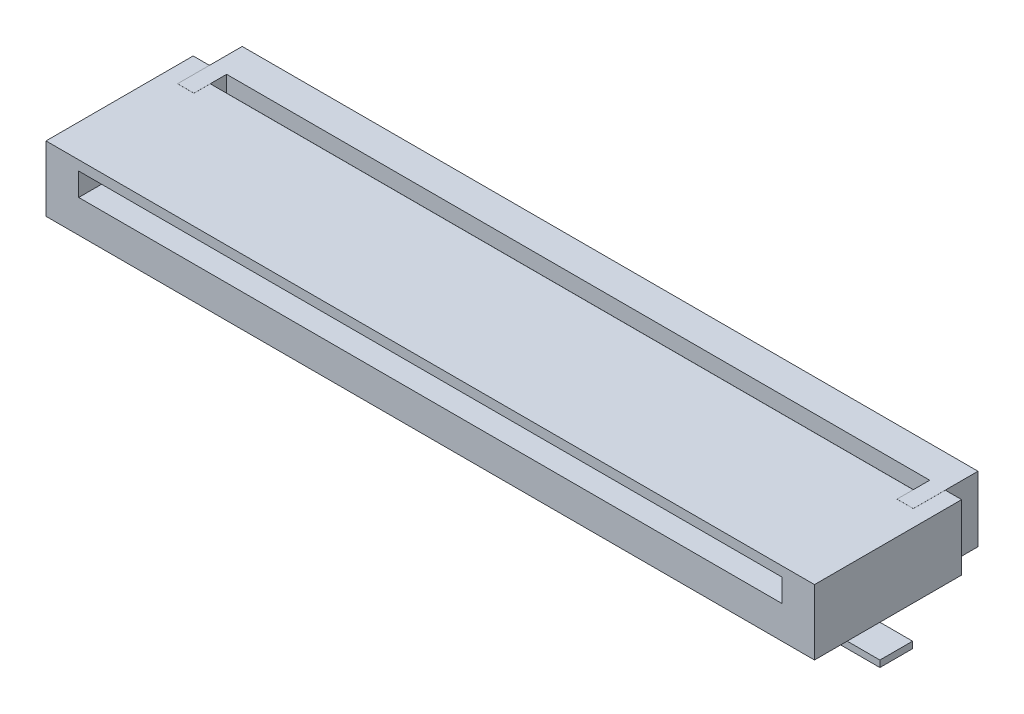
ISO-10303-21;
HEADER;
FILE_DESCRIPTION(('STEP AP214'),'2;1');
FILE_NAME('part.step','',(''),(''),'','','');
FILE_SCHEMA(('AUTOMOTIVE_DESIGN { 1 0 10303 214 1 1 1 1 }'));
ENDSEC;
DATA;
#1=APPLICATION_CONTEXT('core data for automotive mechanical design processes');
#2=APPLICATION_PROTOCOL_DEFINITION('international standard','automotive_design',2000,#1);
#3=PRODUCT_CONTEXT('',#1,'mechanical');
#4=PRODUCT('Part','Part','',(#3));
#5=PRODUCT_RELATED_PRODUCT_CATEGORY('part','',(#4));
#6=PRODUCT_DEFINITION_FORMATION('','',#4);
#7=PRODUCT_DEFINITION_CONTEXT('part definition',#1,'design');
#8=PRODUCT_DEFINITION('design','',#6,#7);
#9=PRODUCT_DEFINITION_SHAPE('','',#8);
#10=(LENGTH_UNIT() NAMED_UNIT(*) SI_UNIT(.MILLI.,.METRE.));
#11=(NAMED_UNIT(*) PLANE_ANGLE_UNIT() SI_UNIT($,.RADIAN.));
#12=(NAMED_UNIT(*) SI_UNIT($,.STERADIAN.) SOLID_ANGLE_UNIT());
#13=UNCERTAINTY_MEASURE_WITH_UNIT(LENGTH_MEASURE(1.E-05),#10,'distance_accuracy_value','');
#14=(GEOMETRIC_REPRESENTATION_CONTEXT(3) GLOBAL_UNCERTAINTY_ASSIGNED_CONTEXT((#13)) GLOBAL_UNIT_ASSIGNED_CONTEXT((#10,
#11,#12)) REPRESENTATION_CONTEXT('',''));
#15=CARTESIAN_POINT('',(0.,0.,0.));
#16=DIRECTION('',(0.,0.,1.));
#17=DIRECTION('',(1.,0.,0.));
#18=AXIS2_PLACEMENT_3D('',#15,#16,#17);
#19=CARTESIAN_POINT('',(11.75,2.,2.75));
#20=DIRECTION('',(-1.,0.,0.));
#21=DIRECTION('',(0.,0.,1.));
#22=AXIS2_PLACEMENT_3D('',#19,#20,#21);
#23=PLANE('',#22);
#24=DIRECTION('',(0.,0.,-1.));
#25=VECTOR('',#24,1.);
#26=CARTESIAN_POINT('',(11.75,1.998,-1.75));
#27=LINE('',#26,#25);
#28=CARTESIAN_POINT('',(11.75,1.998,2.75));
#29=VERTEX_POINT('',#28);
#30=CARTESIAN_POINT('',(11.75,1.998,-1.75));
#31=VERTEX_POINT('',#30);
#32=EDGE_CURVE('E300',#29,#31,#27,.T.);
#33=ORIENTED_EDGE('',*,*,#32,.F.);
#34=DIRECTION('',(0.,-1.,0.));
#35=VECTOR('',#34,1.);
#36=CARTESIAN_POINT('',(11.75,2.,2.75));
#37=LINE('',#36,#35);
#38=CARTESIAN_POINT('',(11.75,0.,2.75));
#39=VERTEX_POINT('',#38);
#40=EDGE_CURVE('E500',#29,#39,#37,.T.);
#41=ORIENTED_EDGE('',*,*,#40,.T.);
#42=DIRECTION('',(0.,0.,-1.));
#43=VECTOR('',#42,1.);
#44=CARTESIAN_POINT('',(11.75,0.,2.75));
#45=LINE('',#44,#43);
#46=CARTESIAN_POINT('',(11.75,0.,1.75));
#47=VERTEX_POINT('',#46);
#48=EDGE_CURVE('E502',#39,#47,#45,.T.);
#49=ORIENTED_EDGE('',*,*,#48,.T.);
#50=CARTESIAN_POINT('',(11.75,0.,0.75));
#51=VERTEX_POINT('',#50);
#52=EDGE_CURVE('E506',#47,#51,#45,.T.);
#53=ORIENTED_EDGE('',*,*,#52,.T.);
#54=CARTESIAN_POINT('',(11.75,0.,-1.75));
#55=VERTEX_POINT('',#54);
#56=EDGE_CURVE('E492',#51,#55,#45,.T.);
#57=ORIENTED_EDGE('',*,*,#56,.T.);
#58=DIRECTION('',(0.,1.,0.));
#59=VECTOR('',#58,1.);
#60=CARTESIAN_POINT('',(11.75,0.,-1.75));
#61=LINE('',#60,#59);
#62=EDGE_CURVE('E472',#55,#31,#61,.T.);
#63=ORIENTED_EDGE('',*,*,#62,.T.);
#64=EDGE_LOOP('',(#33,#41,#49,#53,#57,#63));
#65=FACE_BOUND('',#64,.T.);
#66=ADVANCED_FACE('F37',(#65),#23,.F.);
#67=CARTESIAN_POINT('',(-11.75,2.,2.75));
#68=DIRECTION('',(1.,0.,0.));
#69=DIRECTION('',(0.,0.,-1.));
#70=AXIS2_PLACEMENT_3D('',#67,#68,#69);
#71=PLANE('',#70);
#72=DIRECTION('',(0.,0.,1.));
#73=VECTOR('',#72,1.);
#74=CARTESIAN_POINT('',(-11.75,1.998,-1.75));
#75=LINE('',#74,#73);
#76=CARTESIAN_POINT('',(-11.75,1.998,-1.75));
#77=VERTEX_POINT('',#76);
#78=CARTESIAN_POINT('',(-11.75,1.998,2.75));
#79=VERTEX_POINT('',#78);
#80=EDGE_CURVE('E295',#77,#79,#75,.T.);
#81=ORIENTED_EDGE('',*,*,#80,.F.);
#82=DIRECTION('',(0.,1.,0.));
#83=VECTOR('',#82,1.);
#84=CARTESIAN_POINT('',(-11.75,0.,-1.75));
#85=LINE('',#84,#83);
#86=CARTESIAN_POINT('',(-11.75,0.,-1.75));
#87=VERTEX_POINT('',#86);
#88=EDGE_CURVE('E486',#87,#77,#85,.T.);
#89=ORIENTED_EDGE('',*,*,#88,.F.);
#90=DIRECTION('',(0.,0.,1.));
#91=VECTOR('',#90,1.);
#92=CARTESIAN_POINT('',(-11.75,0.,2.75));
#93=LINE('',#92,#91);
#94=CARTESIAN_POINT('',(-11.75,0.,0.75));
#95=VERTEX_POINT('',#94);
#96=EDGE_CURVE('E509',#87,#95,#93,.T.);
#97=ORIENTED_EDGE('',*,*,#96,.T.);
#98=CARTESIAN_POINT('',(-11.75,0.,1.75));
#99=VERTEX_POINT('',#98);
#100=EDGE_CURVE('E512',#95,#99,#93,.T.);
#101=ORIENTED_EDGE('',*,*,#100,.T.);
#102=CARTESIAN_POINT('',(-11.75,0.,2.75));
#103=VERTEX_POINT('',#102);
#104=EDGE_CURVE('E508',#99,#103,#93,.T.);
#105=ORIENTED_EDGE('',*,*,#104,.T.);
#106=DIRECTION('',(0.,-1.,0.));
#107=VECTOR('',#106,1.);
#108=CARTESIAN_POINT('',(-11.75,2.,2.75));
#109=LINE('',#108,#107);
#110=EDGE_CURVE('E516',#79,#103,#109,.T.);
#111=ORIENTED_EDGE('',*,*,#110,.F.);
#112=EDGE_LOOP('',(#81,#89,#97,#101,#105,#111));
#113=FACE_BOUND('',#112,.T.);
#114=ADVANCED_FACE('F549',(#113),#71,.F.);
#115=CARTESIAN_POINT('',(-11.75,2.,2.75));
#116=DIRECTION('',(0.,0.,-1.));
#117=DIRECTION('',(-1.,0.,0.));
#118=AXIS2_PLACEMENT_3D('',#115,#116,#117);
#119=PLANE('',#118);
#120=DIRECTION('',(1.,0.,0.));
#121=VECTOR('',#120,1.);
#122=CARTESIAN_POINT('',(-10.75,1.,2.75));
#123=LINE('',#122,#121);
#124=CARTESIAN_POINT('',(-10.75,1.,2.75));
#125=VERTEX_POINT('',#124);
#126=CARTESIAN_POINT('',(10.75,1.,2.75));
#127=VERTEX_POINT('',#126);
#128=EDGE_CURVE('E351',#125,#127,#123,.T.);
#129=ORIENTED_EDGE('',*,*,#128,.F.);
#130=DIRECTION('',(0.,-1.,0.));
#131=VECTOR('',#130,1.);
#132=CARTESIAN_POINT('',(-10.75,1.7,2.75));
#133=LINE('',#132,#131);
#134=CARTESIAN_POINT('',(-10.75,1.7,2.75));
#135=VERTEX_POINT('',#134);
#136=EDGE_CURVE('E334',#135,#125,#133,.T.);
#137=ORIENTED_EDGE('',*,*,#136,.F.);
#138=DIRECTION('',(-1.,0.,0.));
#139=VECTOR('',#138,1.);
#140=CARTESIAN_POINT('',(-10.75,1.7,2.75));
#141=LINE('',#140,#139);
#142=CARTESIAN_POINT('',(10.75,1.7,2.75));
#143=VERTEX_POINT('',#142);
#144=EDGE_CURVE('E344',#143,#135,#141,.T.);
#145=ORIENTED_EDGE('',*,*,#144,.F.);
#146=DIRECTION('',(0.,1.,0.));
#147=VECTOR('',#146,1.);
#148=CARTESIAN_POINT('',(10.75,1.7,2.75));
#149=LINE('',#148,#147);
#150=EDGE_CURVE('E354',#127,#143,#149,.T.);
#151=ORIENTED_EDGE('',*,*,#150,.F.);
#152=EDGE_LOOP('',(#129,#137,#145,#151));
#153=FACE_BOUND('',#152,.T.);
#154=DIRECTION('',(1.,0.,0.));
#155=VECTOR('',#154,1.);
#156=CARTESIAN_POINT('',(-11.75,1.998,2.75));
#157=LINE('',#156,#155);
#158=EDGE_CURVE('E298',#79,#29,#157,.T.);
#159=ORIENTED_EDGE('',*,*,#158,.F.);
#160=ORIENTED_EDGE('',*,*,#110,.T.);
#161=DIRECTION('',(1.,0.,0.));
#162=VECTOR('',#161,1.);
#163=CARTESIAN_POINT('',(-11.75,0.,2.75));
#164=LINE('',#163,#162);
#165=EDGE_CURVE('E501',#103,#39,#164,.T.);
#166=ORIENTED_EDGE('',*,*,#165,.T.);
#167=ORIENTED_EDGE('',*,*,#40,.F.);
#168=EDGE_LOOP('',(#159,#160,#166,#167));
#169=FACE_BOUND('',#168,.T.);
#170=ADVANCED_FACE('F555',(#153,#169),#119,.F.);
#171=CARTESIAN_POINT('',(-11.75,0.,-1.75));
#172=DIRECTION('',(0.,0.,1.));
#173=DIRECTION('',(1.,0.,0.));
#174=AXIS2_PLACEMENT_3D('',#171,#172,#173);
#175=PLANE('',#174);
#176=DIRECTION('',(-1.,0.,0.));
#177=VECTOR('',#176,1.);
#178=CARTESIAN_POINT('',(-11.25,1.998,-1.75));
#179=LINE('',#178,#177);
#180=CARTESIAN_POINT('',(-11.25,1.998,-1.75));
#181=VERTEX_POINT('',#180);
#182=EDGE_CURVE('E293',#181,#77,#179,.T.);
#183=ORIENTED_EDGE('',*,*,#182,.F.);
#184=DIRECTION('',(0.,1.,0.));
#185=VECTOR('',#184,1.);
#186=CARTESIAN_POINT('',(-11.25,0.,-1.75));
#187=LINE('',#186,#185);
#188=CARTESIAN_POINT('',(-11.25,0.,-1.75));
#189=VERTEX_POINT('',#188);
#190=EDGE_CURVE('E493',#189,#181,#187,.T.);
#191=ORIENTED_EDGE('',*,*,#190,.F.);
#192=DIRECTION('',(1.,0.,0.));
#193=VECTOR('',#192,1.);
#194=CARTESIAN_POINT('',(-11.75,0.,-1.75));
#195=LINE('',#194,#193);
#196=EDGE_CURVE('E480',#87,#189,#195,.T.);
#197=ORIENTED_EDGE('',*,*,#196,.F.);
#198=ORIENTED_EDGE('',*,*,#88,.T.);
#199=EDGE_LOOP('',(#183,#191,#197,#198));
#200=FACE_BOUND('',#199,.T.);
#201=ADVANCED_FACE('F626',(#200),#175,.F.);
#202=CARTESIAN_POINT('',(11.75,0.,-1.75));
#203=DIRECTION('',(0.,0.,1.));
#204=DIRECTION('',(1.,0.,0.));
#205=AXIS2_PLACEMENT_3D('',#202,#203,#204);
#206=PLANE('',#205);
#207=DIRECTION('',(-1.,0.,0.));
#208=VECTOR('',#207,1.);
#209=CARTESIAN_POINT('',(11.25,1.998,-1.75));
#210=LINE('',#209,#208);
#211=CARTESIAN_POINT('',(11.25,1.998,-1.75));
#212=VERTEX_POINT('',#211);
#213=EDGE_CURVE('E58',#31,#212,#210,.T.);
#214=ORIENTED_EDGE('',*,*,#213,.F.);
#215=ORIENTED_EDGE('',*,*,#62,.F.);
#216=DIRECTION('',(1.,0.,0.));
#217=VECTOR('',#216,1.);
#218=CARTESIAN_POINT('',(11.75,0.,-1.75));
#219=LINE('',#218,#217);
#220=CARTESIAN_POINT('',(11.25,0.,-1.75));
#221=VERTEX_POINT('',#220);
#222=EDGE_CURVE('E467',#221,#55,#219,.T.);
#223=ORIENTED_EDGE('',*,*,#222,.F.);
#224=DIRECTION('',(0.,1.,0.));
#225=VECTOR('',#224,1.);
#226=CARTESIAN_POINT('',(11.25,0.,-1.75));
#227=LINE('',#226,#225);
#228=EDGE_CURVE('E476',#221,#212,#227,.T.);
#229=ORIENTED_EDGE('',*,*,#228,.T.);
#230=EDGE_LOOP('',(#214,#215,#223,#229));
#231=FACE_BOUND('',#230,.T.);
#232=ADVANCED_FACE('F563',(#231),#206,.F.);
#233=CARTESIAN_POINT('',(0.,0.,0.));
#234=DIRECTION('',(0.,-1.,0.));
#235=DIRECTION('',(0.,0.,-1.));
#236=AXIS2_PLACEMENT_3D('',#233,#234,#235);
#237=PLANE('',#236);
#238=DIRECTION('',(0.,0.,-1.));
#239=VECTOR('',#238,1.);
#240=CARTESIAN_POINT('',(10.75,0.,1.75));
#241=LINE('',#240,#239);
#242=CARTESIAN_POINT('',(10.75,0.,1.75));
#243=VERTEX_POINT('',#242);
#244=CARTESIAN_POINT('',(10.75,0.,0.75));
#245=VERTEX_POINT('',#244);
#246=EDGE_CURVE('E410',#243,#245,#241,.T.);
#247=ORIENTED_EDGE('',*,*,#246,.F.);
#248=DIRECTION('',(1.,0.,0.));
#249=VECTOR('',#248,1.);
#250=CARTESIAN_POINT('',(0.,0.,1.75));
#251=LINE('',#250,#249);
#252=EDGE_CURVE('E44',#243,#47,#251,.T.);
#253=ORIENTED_EDGE('',*,*,#252,.T.);
#254=ORIENTED_EDGE('',*,*,#48,.F.);
#255=ORIENTED_EDGE('',*,*,#165,.F.);
#256=ORIENTED_EDGE('',*,*,#104,.F.);
#257=DIRECTION('',(-1.,0.,0.));
#258=VECTOR('',#257,1.);
#259=CARTESIAN_POINT('',(-12.75,0.,1.75));
#260=LINE('',#259,#258);
#261=CARTESIAN_POINT('',(-10.75,0.,1.75));
#262=VERTEX_POINT('',#261);
#263=EDGE_CURVE('E433',#262,#99,#260,.T.);
#264=ORIENTED_EDGE('',*,*,#263,.F.);
#265=DIRECTION('',(0.,0.,1.));
#266=VECTOR('',#265,1.);
#267=CARTESIAN_POINT('',(-10.75,0.,1.75));
#268=LINE('',#267,#266);
#269=CARTESIAN_POINT('',(-10.75,0.,0.75));
#270=VERTEX_POINT('',#269);
#271=EDGE_CURVE('E445',#270,#262,#268,.T.);
#272=ORIENTED_EDGE('',*,*,#271,.F.);
#273=DIRECTION('',(1.,0.,0.));
#274=VECTOR('',#273,1.);
#275=CARTESIAN_POINT('',(-12.75,0.,0.75));
#276=LINE('',#275,#274);
#277=EDGE_CURVE('E446',#95,#270,#276,.T.);
#278=ORIENTED_EDGE('',*,*,#277,.F.);
#279=ORIENTED_EDGE('',*,*,#96,.F.);
#280=ORIENTED_EDGE('',*,*,#196,.T.);
#281=DIRECTION('',(0.,0.,-1.));
#282=VECTOR('',#281,1.);
#283=CARTESIAN_POINT('',(-11.25,0.,-2.75));
#284=LINE('',#283,#282);
#285=CARTESIAN_POINT('',(-11.25,0.,-2.75));
#286=VERTEX_POINT('',#285);
#287=EDGE_CURVE('E483',#189,#286,#284,.T.);
#288=ORIENTED_EDGE('',*,*,#287,.T.);
#289=DIRECTION('',(-1.,0.,0.));
#290=VECTOR('',#289,1.);
#291=CARTESIAN_POINT('',(-11.75,0.,-2.75));
#292=LINE('',#291,#290);
#293=CARTESIAN_POINT('',(11.25,0.,-2.75));
#294=VERTEX_POINT('',#293);
#295=EDGE_CURVE('E505',#294,#286,#292,.T.);
#296=ORIENTED_EDGE('',*,*,#295,.F.);
#297=DIRECTION('',(0.,0.,1.));
#298=VECTOR('',#297,1.);
#299=CARTESIAN_POINT('',(11.25,0.,-2.75));
#300=LINE('',#299,#298);
#301=EDGE_CURVE('E464',#294,#221,#300,.T.);
#302=ORIENTED_EDGE('',*,*,#301,.T.);
#303=ORIENTED_EDGE('',*,*,#222,.T.);
#304=ORIENTED_EDGE('',*,*,#56,.F.);
#305=DIRECTION('',(1.,0.,0.));
#306=VECTOR('',#305,1.);
#307=CARTESIAN_POINT('',(12.75,0.,0.75));
#308=LINE('',#307,#306);
#309=EDGE_CURVE('E414',#245,#51,#308,.T.);
#310=ORIENTED_EDGE('',*,*,#309,.F.);
#311=EDGE_LOOP('',(#247,#253,#254,#255,#256,#264,#272,#278,#279,#280,#288,#296,#302,#303,#304,#310));
#312=FACE_BOUND('',#311,.T.);
#313=DIRECTION('',(-1.,0.,0.));
#314=VECTOR('',#313,1.);
#315=CARTESIAN_POINT('',(10.75,0.,-2.35));
#316=LINE('',#315,#314);
#317=CARTESIAN_POINT('',(10.75,0.,-2.35));
#318=VERTEX_POINT('',#317);
#319=CARTESIAN_POINT('',(-10.75,0.,-2.35));
#320=VERTEX_POINT('',#319);
#321=EDGE_CURVE('E381',#318,#320,#316,.T.);
#322=ORIENTED_EDGE('',*,*,#321,.F.);
#323=DIRECTION('',(0.,0.,1.));
#324=VECTOR('',#323,1.);
#325=CARTESIAN_POINT('',(10.75,0.,-2.55));
#326=LINE('',#325,#324);
#327=CARTESIAN_POINT('',(10.75,0.,-2.55));
#328=VERTEX_POINT('',#327);
#329=EDGE_CURVE('E361',#328,#318,#326,.T.);
#330=ORIENTED_EDGE('',*,*,#329,.F.);
#331=DIRECTION('',(1.,0.,0.));
#332=VECTOR('',#331,1.);
#333=CARTESIAN_POINT('',(10.75,0.,-2.55));
#334=LINE('',#333,#332);
#335=CARTESIAN_POINT('',(-10.75,0.,-2.55));
#336=VERTEX_POINT('',#335);
#337=EDGE_CURVE('E372',#336,#328,#334,.T.);
#338=ORIENTED_EDGE('',*,*,#337,.F.);
#339=DIRECTION('',(0.,0.,-1.));
#340=VECTOR('',#339,1.);
#341=CARTESIAN_POINT('',(-10.75,0.,-2.55));
#342=LINE('',#341,#340);
#343=EDGE_CURVE('E383',#320,#336,#342,.T.);
#344=ORIENTED_EDGE('',*,*,#343,.F.);
#345=EDGE_LOOP('',(#322,#330,#338,#344));
#346=FACE_BOUND('',#345,.T.);
#347=ADVANCED_FACE('F550',(#312,#346),#237,.T.);
#348=CARTESIAN_POINT('',(-11.75,2.,-2.75));
#349=DIRECTION('',(0.,0.,1.));
#350=DIRECTION('',(1.,0.,0.));
#351=AXIS2_PLACEMENT_3D('',#348,#349,#350);
#352=PLANE('',#351);
#353=DIRECTION('',(-1.,0.,0.));
#354=VECTOR('',#353,1.);
#355=CARTESIAN_POINT('',(-11.75,2.,-2.75));
#356=LINE('',#355,#354);
#357=CARTESIAN_POINT('',(11.25,2.,-2.75));
#358=VERTEX_POINT('',#357);
#359=CARTESIAN_POINT('',(-11.25,2.,-2.75));
#360=VERTEX_POINT('',#359);
#361=EDGE_CURVE('E498',#358,#360,#356,.T.);
#362=ORIENTED_EDGE('',*,*,#361,.F.);
#363=DIRECTION('',(0.,1.,0.));
#364=VECTOR('',#363,1.);
#365=CARTESIAN_POINT('',(11.25,0.,-2.75));
#366=LINE('',#365,#364);
#367=EDGE_CURVE('E470',#294,#358,#366,.T.);
#368=ORIENTED_EDGE('',*,*,#367,.F.);
#369=ORIENTED_EDGE('',*,*,#295,.T.);
#370=DIRECTION('',(0.,1.,0.));
#371=VECTOR('',#370,1.);
#372=CARTESIAN_POINT('',(-11.25,0.,-2.75));
#373=LINE('',#372,#371);
#374=EDGE_CURVE('E489',#286,#360,#373,.T.);
#375=ORIENTED_EDGE('',*,*,#374,.T.);
#376=EDGE_LOOP('',(#362,#368,#369,#375));
#377=FACE_BOUND('',#376,.T.);
#378=ADVANCED_FACE('F573',(#377),#352,.F.);
#379=CARTESIAN_POINT('',(0.,2.,0.));
#380=DIRECTION('',(0.,-1.,0.));
#381=DIRECTION('',(0.,0.,-1.));
#382=AXIS2_PLACEMENT_3D('',#379,#380,#381);
#383=PLANE('',#382);
#384=DIRECTION('',(0.,0.,1.));
#385=VECTOR('',#384,1.);
#386=CARTESIAN_POINT('',(-10.75,2.,-0.773341088289437));
#387=LINE('',#386,#385);
#388=CARTESIAN_POINT('',(-10.75,2.,-1.77334108828944));
#389=VERTEX_POINT('',#388);
#390=CARTESIAN_POINT('',(-10.75,2.,-0.773341088289437));
#391=VERTEX_POINT('',#390);
#392=EDGE_CURVE('E326',#389,#391,#387,.T.);
#393=ORIENTED_EDGE('',*,*,#392,.F.);
#394=DIRECTION('',(-1.,0.,0.));
#395=VECTOR('',#394,1.);
#396=CARTESIAN_POINT('',(-10.75,2.,-1.77334108828944));
#397=LINE('',#396,#395);
#398=CARTESIAN_POINT('',(10.75,2.,-1.77334108828944));
#399=VERTEX_POINT('',#398);
#400=EDGE_CURVE('E284',#399,#389,#397,.T.);
#401=ORIENTED_EDGE('',*,*,#400,.F.);
#402=DIRECTION('',(0.,0.,-1.));
#403=VECTOR('',#402,1.);
#404=CARTESIAN_POINT('',(10.75,2.,-0.773341088289437));
#405=LINE('',#404,#403);
#406=CARTESIAN_POINT('',(10.75,2.,-0.773341088289437));
#407=VERTEX_POINT('',#406);
#408=EDGE_CURVE('E270',#407,#399,#405,.T.);
#409=ORIENTED_EDGE('',*,*,#408,.F.);
#410=DIRECTION('',(-1.,0.,0.));
#411=VECTOR('',#410,1.);
#412=CARTESIAN_POINT('',(11.25,2.,-0.773341088289437));
#413=LINE('',#412,#411);
#414=CARTESIAN_POINT('',(11.25,2.,-0.773341088289437));
#415=VERTEX_POINT('',#414);
#416=EDGE_CURVE('E292',#415,#407,#413,.T.);
#417=ORIENTED_EDGE('',*,*,#416,.F.);
#418=DIRECTION('',(0.,0.,1.));
#419=VECTOR('',#418,1.);
#420=CARTESIAN_POINT('',(11.25,2.,-2.75));
#421=LINE('',#420,#419);
#422=EDGE_CURVE('E463',#358,#415,#421,.T.);
#423=ORIENTED_EDGE('',*,*,#422,.F.);
#424=ORIENTED_EDGE('',*,*,#361,.T.);
#425=DIRECTION('',(0.,0.,-1.));
#426=VECTOR('',#425,1.);
#427=CARTESIAN_POINT('',(-11.25,2.,-2.75));
#428=LINE('',#427,#426);
#429=CARTESIAN_POINT('',(-11.25,2.,-0.773341088289437));
#430=VERTEX_POINT('',#429);
#431=EDGE_CURVE('E475',#430,#360,#428,.T.);
#432=ORIENTED_EDGE('',*,*,#431,.F.);
#433=DIRECTION('',(-1.,0.,0.));
#434=VECTOR('',#433,1.);
#435=CARTESIAN_POINT('',(-11.25,2.,-0.773341088289437));
#436=LINE('',#435,#434);
#437=EDGE_CURVE('E296',#391,#430,#436,.T.);
#438=ORIENTED_EDGE('',*,*,#437,.F.);
#439=EDGE_LOOP('',(#393,#401,#409,#417,#423,#424,#432,#438));
#440=FACE_BOUND('',#439,.T.);
#441=ADVANCED_FACE('F576',(#440),#383,.F.);
#442=CARTESIAN_POINT('',(-11.25,0.,-2.75));
#443=DIRECTION('',(1.,0.,0.));
#444=DIRECTION('',(0.,0.,-1.));
#445=AXIS2_PLACEMENT_3D('',#442,#443,#444);
#446=PLANE('',#445);
#447=ORIENTED_EDGE('',*,*,#431,.T.);
#448=ORIENTED_EDGE('',*,*,#374,.F.);
#449=ORIENTED_EDGE('',*,*,#287,.F.);
#450=ORIENTED_EDGE('',*,*,#190,.T.);
#451=DIRECTION('',(0.,0.,-1.));
#452=VECTOR('',#451,1.);
#453=CARTESIAN_POINT('',(-11.25,1.998,-1.75));
#454=LINE('',#453,#452);
#455=CARTESIAN_POINT('',(-11.25,1.998,-0.773341088289437));
#456=VERTEX_POINT('',#455);
#457=EDGE_CURVE('E320',#456,#181,#454,.T.);
#458=ORIENTED_EDGE('',*,*,#457,.F.);
#459=DIRECTION('',(0.,1.,0.));
#460=VECTOR('',#459,1.);
#461=CARTESIAN_POINT('',(-11.25,1.998,-0.773341088289437));
#462=LINE('',#461,#460);
#463=EDGE_CURVE('E331',#456,#430,#462,.T.);
#464=ORIENTED_EDGE('',*,*,#463,.T.);
#465=EDGE_LOOP('',(#447,#448,#449,#450,#458,#464));
#466=FACE_BOUND('',#465,.T.);
#467=ADVANCED_FACE('F580',(#466),#446,.F.);
#468=CARTESIAN_POINT('',(11.25,0.,-2.75));
#469=DIRECTION('',(-1.,0.,0.));
#470=DIRECTION('',(0.,0.,1.));
#471=AXIS2_PLACEMENT_3D('',#468,#469,#470);
#472=PLANE('',#471);
#473=ORIENTED_EDGE('',*,*,#422,.T.);
#474=DIRECTION('',(0.,1.,0.));
#475=VECTOR('',#474,1.);
#476=CARTESIAN_POINT('',(11.25,1.998,-0.773341088289437));
#477=LINE('',#476,#475);
#478=CARTESIAN_POINT('',(11.25,1.998,-0.773341088289437));
#479=VERTEX_POINT('',#478);
#480=EDGE_CURVE('E322',#479,#415,#477,.T.);
#481=ORIENTED_EDGE('',*,*,#480,.F.);
#482=DIRECTION('',(0.,0.,1.));
#483=VECTOR('',#482,1.);
#484=CARTESIAN_POINT('',(11.25,1.998,-1.75));
#485=LINE('',#484,#483);
#486=EDGE_CURVE('E303',#212,#479,#485,.T.);
#487=ORIENTED_EDGE('',*,*,#486,.F.);
#488=ORIENTED_EDGE('',*,*,#228,.F.);
#489=ORIENTED_EDGE('',*,*,#301,.F.);
#490=ORIENTED_EDGE('',*,*,#367,.T.);
#491=EDGE_LOOP('',(#473,#481,#487,#488,#489,#490));
#492=FACE_BOUND('',#491,.T.);
#493=ADVANCED_FACE('F569',(#492),#472,.F.);
#494=CARTESIAN_POINT('',(-12.75,-0.2,1.75));
#495=DIRECTION('',(1.,0.,0.));
#496=DIRECTION('',(0.,0.,-1.));
#497=AXIS2_PLACEMENT_3D('',#494,#495,#496);
#498=PLANE('',#497);
#499=DIRECTION('',(0.,0.,-1.));
#500=VECTOR('',#499,1.);
#501=CARTESIAN_POINT('',(-12.75,0.,1.75));
#502=LINE('',#501,#500);
#503=CARTESIAN_POINT('',(-12.75,0.,1.75));
#504=VERTEX_POINT('',#503);
#505=CARTESIAN_POINT('',(-12.75,0.,0.75));
#506=VERTEX_POINT('',#505);
#507=EDGE_CURVE('E428',#504,#506,#502,.T.);
#508=ORIENTED_EDGE('',*,*,#507,.T.);
#509=DIRECTION('',(0.,1.,0.));
#510=VECTOR('',#509,1.);
#511=CARTESIAN_POINT('',(-12.75,-0.2,0.75));
#512=LINE('',#511,#510);
#513=CARTESIAN_POINT('',(-12.75,-0.2,0.75));
#514=VERTEX_POINT('',#513);
#515=EDGE_CURVE('E460',#514,#506,#512,.T.);
#516=ORIENTED_EDGE('',*,*,#515,.F.);
#517=DIRECTION('',(0.,0.,-1.));
#518=VECTOR('',#517,1.);
#519=CARTESIAN_POINT('',(-12.75,-0.2,1.75));
#520=LINE('',#519,#518);
#521=CARTESIAN_POINT('',(-12.75,-0.2,1.75));
#522=VERTEX_POINT('',#521);
#523=EDGE_CURVE('E429',#522,#514,#520,.T.);
#524=ORIENTED_EDGE('',*,*,#523,.F.);
#525=DIRECTION('',(0.,1.,0.));
#526=VECTOR('',#525,1.);
#527=CARTESIAN_POINT('',(-12.75,-0.2,1.75));
#528=LINE('',#527,#526);
#529=EDGE_CURVE('E439',#522,#504,#528,.T.);
#530=ORIENTED_EDGE('',*,*,#529,.T.);
#531=EDGE_LOOP('',(#508,#516,#524,#530));
#532=FACE_BOUND('',#531,.T.);
#533=ADVANCED_FACE('F538',(#532),#498,.F.);
#534=CARTESIAN_POINT('',(-12.75,-0.2,0.75));
#535=DIRECTION('',(0.,0.,1.));
#536=DIRECTION('',(1.,0.,0.));
#537=AXIS2_PLACEMENT_3D('',#534,#535,#536);
#538=PLANE('',#537);
#539=EDGE_CURVE('E442',#506,#95,#276,.T.);
#540=ORIENTED_EDGE('',*,*,#539,.T.);
#541=ORIENTED_EDGE('',*,*,#277,.T.);
#542=DIRECTION('',(0.,1.,0.));
#543=VECTOR('',#542,1.);
#544=CARTESIAN_POINT('',(-10.75,-0.2,0.75));
#545=LINE('',#544,#543);
#546=CARTESIAN_POINT('',(-10.75,-0.2,0.75));
#547=VERTEX_POINT('',#546);
#548=EDGE_CURVE('E457',#547,#270,#545,.T.);
#549=ORIENTED_EDGE('',*,*,#548,.F.);
#550=DIRECTION('',(1.,0.,0.));
#551=VECTOR('',#550,1.);
#552=CARTESIAN_POINT('',(-12.75,-0.2,0.75));
#553=LINE('',#552,#551);
#554=EDGE_CURVE('E432',#514,#547,#553,.T.);
#555=ORIENTED_EDGE('',*,*,#554,.F.);
#556=ORIENTED_EDGE('',*,*,#515,.T.);
#557=EDGE_LOOP('',(#540,#541,#549,#555,#556));
#558=FACE_BOUND('',#557,.T.);
#559=ADVANCED_FACE('F524',(#558),#538,.F.);
#560=CARTESIAN_POINT('',(-10.75,-0.2,1.75));
#561=DIRECTION('',(-1.,0.,0.));
#562=DIRECTION('',(0.,0.,1.));
#563=AXIS2_PLACEMENT_3D('',#560,#561,#562);
#564=PLANE('',#563);
#565=ORIENTED_EDGE('',*,*,#271,.T.);
#566=DIRECTION('',(0.,1.,0.));
#567=VECTOR('',#566,1.);
#568=CARTESIAN_POINT('',(-10.75,-0.2,1.75));
#569=LINE('',#568,#567);
#570=CARTESIAN_POINT('',(-10.75,-0.2,1.75));
#571=VERTEX_POINT('',#570);
#572=EDGE_CURVE('E454',#571,#262,#569,.T.);
#573=ORIENTED_EDGE('',*,*,#572,.F.);
#574=DIRECTION('',(0.,0.,1.));
#575=VECTOR('',#574,1.);
#576=CARTESIAN_POINT('',(-10.75,-0.2,1.75));
#577=LINE('',#576,#575);
#578=EDGE_CURVE('E435',#547,#571,#577,.T.);
#579=ORIENTED_EDGE('',*,*,#578,.F.);
#580=ORIENTED_EDGE('',*,*,#548,.T.);
#581=EDGE_LOOP('',(#565,#573,#579,#580));
#582=FACE_BOUND('',#581,.T.);
#583=ADVANCED_FACE('F528',(#582),#564,.F.);
#584=CARTESIAN_POINT('',(-12.75,-0.2,1.75));
#585=DIRECTION('',(0.,0.,-1.));
#586=DIRECTION('',(-1.,0.,0.));
#587=AXIS2_PLACEMENT_3D('',#584,#585,#586);
#588=PLANE('',#587);
#589=ORIENTED_EDGE('',*,*,#263,.T.);
#590=EDGE_CURVE('E449',#99,#504,#260,.T.);
#591=ORIENTED_EDGE('',*,*,#590,.T.);
#592=ORIENTED_EDGE('',*,*,#529,.F.);
#593=DIRECTION('',(-1.,0.,0.));
#594=VECTOR('',#593,1.);
#595=CARTESIAN_POINT('',(-12.75,-0.2,1.75));
#596=LINE('',#595,#594);
#597=EDGE_CURVE('E437',#571,#522,#596,.T.);
#598=ORIENTED_EDGE('',*,*,#597,.F.);
#599=ORIENTED_EDGE('',*,*,#572,.T.);
#600=EDGE_LOOP('',(#589,#591,#592,#598,#599));
#601=FACE_BOUND('',#600,.T.);
#602=ADVANCED_FACE('F653',(#601),#588,.F.);
#603=CARTESIAN_POINT('',(0.,-0.2,0.));
#604=DIRECTION('',(0.,-1.,0.));
#605=DIRECTION('',(0.,0.,-1.));
#606=AXIS2_PLACEMENT_3D('',#603,#604,#605);
#607=PLANE('',#606);
#608=ORIENTED_EDGE('',*,*,#523,.T.);
#609=ORIENTED_EDGE('',*,*,#554,.T.);
#610=ORIENTED_EDGE('',*,*,#578,.T.);
#611=ORIENTED_EDGE('',*,*,#597,.T.);
#612=EDGE_LOOP('',(#608,#609,#610,#611));
#613=FACE_BOUND('',#612,.T.);
#614=ADVANCED_FACE('F532',(#613),#607,.T.);
#615=CARTESIAN_POINT('',(0.,0.,0.));
#616=DIRECTION('',(0.,-1.,0.));
#617=DIRECTION('',(0.,0.,-1.));
#618=AXIS2_PLACEMENT_3D('',#615,#616,#617);
#619=PLANE('',#618);
#620=ORIENTED_EDGE('',*,*,#100,.F.);
#621=ORIENTED_EDGE('',*,*,#539,.F.);
#622=ORIENTED_EDGE('',*,*,#507,.F.);
#623=ORIENTED_EDGE('',*,*,#590,.F.);
#624=EDGE_LOOP('',(#620,#621,#622,#623));
#625=FACE_BOUND('',#624,.T.);
#626=ADVANCED_FACE('F542',(#625),#619,.F.);
#627=CARTESIAN_POINT('',(0.,0.,0.));
#628=DIRECTION('',(0.,-1.,0.));
#629=DIRECTION('',(0.,0.,-1.));
#630=AXIS2_PLACEMENT_3D('',#627,#628,#629);
#631=PLANE('',#630);
#632=CARTESIAN_POINT('',(12.75,0.,0.75));
#633=VERTEX_POINT('',#632);
#634=EDGE_CURVE('E413',#51,#633,#308,.T.);
#635=ORIENTED_EDGE('',*,*,#634,.F.);
#636=ORIENTED_EDGE('',*,*,#52,.F.);
#637=DIRECTION('',(-1.,0.,0.));
#638=VECTOR('',#637,1.);
#639=CARTESIAN_POINT('',(12.75,0.,1.75));
#640=LINE('',#639,#638);
#641=CARTESIAN_POINT('',(12.75,0.,1.75));
#642=VERTEX_POINT('',#641);
#643=EDGE_CURVE('E396',#642,#47,#640,.T.);
#644=ORIENTED_EDGE('',*,*,#643,.F.);
#645=DIRECTION('',(0.,0.,1.));
#646=VECTOR('',#645,1.);
#647=CARTESIAN_POINT('',(12.75,0.,1.75));
#648=LINE('',#647,#646);
#649=EDGE_CURVE('E401',#633,#642,#648,.T.);
#650=ORIENTED_EDGE('',*,*,#649,.F.);
#651=EDGE_LOOP('',(#635,#636,#644,#650));
#652=FACE_BOUND('',#651,.T.);
#653=ADVANCED_FACE('F659',(#652),#631,.F.);
#654=CARTESIAN_POINT('',(12.75,-0.2,1.75));
#655=DIRECTION('',(0.,0.,-1.));
#656=DIRECTION('',(-1.,0.,0.));
#657=AXIS2_PLACEMENT_3D('',#654,#655,#656);
#658=PLANE('',#657);
#659=ORIENTED_EDGE('',*,*,#643,.T.);
#660=ORIENTED_EDGE('',*,*,#252,.F.);
#661=DIRECTION('',(0.,1.,0.));
#662=VECTOR('',#661,1.);
#663=CARTESIAN_POINT('',(10.75,-0.2,1.75));
#664=LINE('',#663,#662);
#665=CARTESIAN_POINT('',(10.75,-0.2,1.75));
#666=VERTEX_POINT('',#665);
#667=EDGE_CURVE('E425',#666,#243,#664,.T.);
#668=ORIENTED_EDGE('',*,*,#667,.F.);
#669=DIRECTION('',(-1.,0.,0.));
#670=VECTOR('',#669,1.);
#671=CARTESIAN_POINT('',(12.75,-0.2,1.75));
#672=LINE('',#671,#670);
#673=CARTESIAN_POINT('',(12.75,-0.2,1.75));
#674=VERTEX_POINT('',#673);
#675=EDGE_CURVE('E397',#674,#666,#672,.T.);
#676=ORIENTED_EDGE('',*,*,#675,.F.);
#677=DIRECTION('',(0.,1.,0.));
#678=VECTOR('',#677,1.);
#679=CARTESIAN_POINT('',(12.75,-0.2,1.75));
#680=LINE('',#679,#678);
#681=EDGE_CURVE('E407',#674,#642,#680,.T.);
#682=ORIENTED_EDGE('',*,*,#681,.T.);
#683=EDGE_LOOP('',(#659,#660,#668,#676,#682));
#684=FACE_BOUND('',#683,.T.);
#685=ADVANCED_FACE('F662',(#684),#658,.F.);
#686=CARTESIAN_POINT('',(10.75,-0.2,1.75));
#687=DIRECTION('',(1.,0.,0.));
#688=DIRECTION('',(0.,0.,-1.));
#689=AXIS2_PLACEMENT_3D('',#686,#687,#688);
#690=PLANE('',#689);
#691=ORIENTED_EDGE('',*,*,#246,.T.);
#692=DIRECTION('',(0.,1.,0.));
#693=VECTOR('',#692,1.);
#694=CARTESIAN_POINT('',(10.75,-0.2,0.75));
#695=LINE('',#694,#693);
#696=CARTESIAN_POINT('',(10.75,-0.2,0.75));
#697=VERTEX_POINT('',#696);
#698=EDGE_CURVE('E423',#697,#245,#695,.T.);
#699=ORIENTED_EDGE('',*,*,#698,.F.);
#700=DIRECTION('',(0.,0.,-1.));
#701=VECTOR('',#700,1.);
#702=CARTESIAN_POINT('',(10.75,-0.2,1.75));
#703=LINE('',#702,#701);
#704=EDGE_CURVE('E400',#666,#697,#703,.T.);
#705=ORIENTED_EDGE('',*,*,#704,.F.);
#706=ORIENTED_EDGE('',*,*,#667,.T.);
#707=EDGE_LOOP('',(#691,#699,#705,#706));
#708=FACE_BOUND('',#707,.T.);
#709=ADVANCED_FACE('F665',(#708),#690,.F.);
#710=CARTESIAN_POINT('',(12.75,-0.2,0.75));
#711=DIRECTION('',(0.,0.,1.));
#712=DIRECTION('',(1.,0.,0.));
#713=AXIS2_PLACEMENT_3D('',#710,#711,#712);
#714=PLANE('',#713);
#715=ORIENTED_EDGE('',*,*,#309,.T.);
#716=ORIENTED_EDGE('',*,*,#634,.T.);
#717=DIRECTION('',(0.,1.,0.));
#718=VECTOR('',#717,1.);
#719=CARTESIAN_POINT('',(12.75,-0.2,0.75));
#720=LINE('',#719,#718);
#721=CARTESIAN_POINT('',(12.75,-0.2,0.75));
#722=VERTEX_POINT('',#721);
#723=EDGE_CURVE('E420',#722,#633,#720,.T.);
#724=ORIENTED_EDGE('',*,*,#723,.F.);
#725=DIRECTION('',(1.,0.,0.));
#726=VECTOR('',#725,1.);
#727=CARTESIAN_POINT('',(12.75,-0.2,0.75));
#728=LINE('',#727,#726);
#729=EDGE_CURVE('E403',#697,#722,#728,.T.);
#730=ORIENTED_EDGE('',*,*,#729,.F.);
#731=ORIENTED_EDGE('',*,*,#698,.T.);
#732=EDGE_LOOP('',(#715,#716,#724,#730,#731));
#733=FACE_BOUND('',#732,.T.);
#734=ADVANCED_FACE('F669',(#733),#714,.F.);
#735=CARTESIAN_POINT('',(12.75,-0.2,1.75));
#736=DIRECTION('',(-1.,0.,0.));
#737=DIRECTION('',(0.,0.,1.));
#738=AXIS2_PLACEMENT_3D('',#735,#736,#737);
#739=PLANE('',#738);
#740=ORIENTED_EDGE('',*,*,#649,.T.);
#741=ORIENTED_EDGE('',*,*,#681,.F.);
#742=DIRECTION('',(0.,0.,1.));
#743=VECTOR('',#742,1.);
#744=CARTESIAN_POINT('',(12.75,-0.2,1.75));
#745=LINE('',#744,#743);
#746=EDGE_CURVE('E405',#722,#674,#745,.T.);
#747=ORIENTED_EDGE('',*,*,#746,.F.);
#748=ORIENTED_EDGE('',*,*,#723,.T.);
#749=EDGE_LOOP('',(#740,#741,#747,#748));
#750=FACE_BOUND('',#749,.T.);
#751=ADVANCED_FACE('F673',(#750),#739,.F.);
#752=CARTESIAN_POINT('',(0.,-0.2,0.));
#753=DIRECTION('',(0.,-1.,0.));
#754=DIRECTION('',(0.,0.,-1.));
#755=AXIS2_PLACEMENT_3D('',#752,#753,#754);
#756=PLANE('',#755);
#757=ORIENTED_EDGE('',*,*,#675,.T.);
#758=ORIENTED_EDGE('',*,*,#704,.T.);
#759=ORIENTED_EDGE('',*,*,#729,.T.);
#760=ORIENTED_EDGE('',*,*,#746,.T.);
#761=EDGE_LOOP('',(#757,#758,#759,#760));
#762=FACE_BOUND('',#761,.T.);
#763=ADVANCED_FACE('F677',(#762),#756,.T.);
#764=CARTESIAN_POINT('',(10.75,-0.3,-2.55));
#765=DIRECTION('',(-1.,0.,0.));
#766=DIRECTION('',(0.,0.,1.));
#767=AXIS2_PLACEMENT_3D('',#764,#765,#766);
#768=PLANE('',#767);
#769=ORIENTED_EDGE('',*,*,#329,.T.);
#770=DIRECTION('',(0.,1.,0.));
#771=VECTOR('',#770,1.);
#772=CARTESIAN_POINT('',(10.75,-0.3,-2.35));
#773=LINE('',#772,#771);
#774=CARTESIAN_POINT('',(10.75,-0.3,-2.35));
#775=VERTEX_POINT('',#774);
#776=EDGE_CURVE('E394',#775,#318,#773,.T.);
#777=ORIENTED_EDGE('',*,*,#776,.F.);
#778=DIRECTION('',(0.,0.,1.));
#779=VECTOR('',#778,1.);
#780=CARTESIAN_POINT('',(10.75,-0.3,-2.55));
#781=LINE('',#780,#779);
#782=CARTESIAN_POINT('',(10.75,-0.3,-2.55));
#783=VERTEX_POINT('',#782);
#784=EDGE_CURVE('E368',#783,#775,#781,.T.);
#785=ORIENTED_EDGE('',*,*,#784,.F.);
#786=DIRECTION('',(0.,1.,0.));
#787=VECTOR('',#786,1.);
#788=CARTESIAN_POINT('',(10.75,-0.3,-2.55));
#789=LINE('',#788,#787);
#790=EDGE_CURVE('E378',#783,#328,#789,.T.);
#791=ORIENTED_EDGE('',*,*,#790,.T.);
#792=EDGE_LOOP('',(#769,#777,#785,#791));
#793=FACE_BOUND('',#792,.T.);
#794=ADVANCED_FACE('F684',(#793),#768,.F.);
#795=CARTESIAN_POINT('',(10.75,-0.3,-2.35));
#796=DIRECTION('',(0.,0.,-1.));
#797=DIRECTION('',(-1.,0.,0.));
#798=AXIS2_PLACEMENT_3D('',#795,#796,#797);
#799=PLANE('',#798);
#800=ORIENTED_EDGE('',*,*,#321,.T.);
#801=DIRECTION('',(0.,1.,0.));
#802=VECTOR('',#801,1.);
#803=CARTESIAN_POINT('',(-10.75,-0.3,-2.35));
#804=LINE('',#803,#802);
#805=CARTESIAN_POINT('',(-10.75,-0.3,-2.35));
#806=VERTEX_POINT('',#805);
#807=EDGE_CURVE('E391',#806,#320,#804,.T.);
#808=ORIENTED_EDGE('',*,*,#807,.F.);
#809=DIRECTION('',(-1.,0.,0.));
#810=VECTOR('',#809,1.);
#811=CARTESIAN_POINT('',(10.75,-0.3,-2.35));
#812=LINE('',#811,#810);
#813=EDGE_CURVE('E371',#775,#806,#812,.T.);
#814=ORIENTED_EDGE('',*,*,#813,.F.);
#815=ORIENTED_EDGE('',*,*,#776,.T.);
#816=EDGE_LOOP('',(#800,#808,#814,#815));
#817=FACE_BOUND('',#816,.T.);
#818=ADVANCED_FACE('F688',(#817),#799,.F.);
#819=CARTESIAN_POINT('',(-10.75,-0.3,-2.55));
#820=DIRECTION('',(1.,0.,0.));
#821=DIRECTION('',(0.,0.,-1.));
#822=AXIS2_PLACEMENT_3D('',#819,#820,#821);
#823=PLANE('',#822);
#824=ORIENTED_EDGE('',*,*,#343,.T.);
#825=DIRECTION('',(0.,1.,0.));
#826=VECTOR('',#825,1.);
#827=CARTESIAN_POINT('',(-10.75,-0.3,-2.55));
#828=LINE('',#827,#826);
#829=CARTESIAN_POINT('',(-10.75,-0.3,-2.55));
#830=VERTEX_POINT('',#829);
#831=EDGE_CURVE('E389',#830,#336,#828,.T.);
#832=ORIENTED_EDGE('',*,*,#831,.F.);
#833=DIRECTION('',(0.,0.,-1.));
#834=VECTOR('',#833,1.);
#835=CARTESIAN_POINT('',(-10.75,-0.3,-2.55));
#836=LINE('',#835,#834);
#837=EDGE_CURVE('E374',#806,#830,#836,.T.);
#838=ORIENTED_EDGE('',*,*,#837,.F.);
#839=ORIENTED_EDGE('',*,*,#807,.T.);
#840=EDGE_LOOP('',(#824,#832,#838,#839));
#841=FACE_BOUND('',#840,.T.);
#842=ADVANCED_FACE('F692',(#841),#823,.F.);
#843=CARTESIAN_POINT('',(10.75,-0.3,-2.55));
#844=DIRECTION('',(0.,0.,1.));
#845=DIRECTION('',(1.,0.,0.));
#846=AXIS2_PLACEMENT_3D('',#843,#844,#845);
#847=PLANE('',#846);
#848=ORIENTED_EDGE('',*,*,#337,.T.);
#849=ORIENTED_EDGE('',*,*,#790,.F.);
#850=DIRECTION('',(1.,0.,0.));
#851=VECTOR('',#850,1.);
#852=CARTESIAN_POINT('',(10.75,-0.3,-2.55));
#853=LINE('',#852,#851);
#854=EDGE_CURVE('E376',#830,#783,#853,.T.);
#855=ORIENTED_EDGE('',*,*,#854,.F.);
#856=ORIENTED_EDGE('',*,*,#831,.T.);
#857=EDGE_LOOP('',(#848,#849,#855,#856));
#858=FACE_BOUND('',#857,.T.);
#859=ADVANCED_FACE('F696',(#858),#847,.F.);
#860=CARTESIAN_POINT('',(0.,-0.3,0.));
#861=DIRECTION('',(0.,-1.,0.));
#862=DIRECTION('',(0.,0.,-1.));
#863=AXIS2_PLACEMENT_3D('',#860,#861,#862);
#864=PLANE('',#863);
#865=ORIENTED_EDGE('',*,*,#784,.T.);
#866=ORIENTED_EDGE('',*,*,#813,.T.);
#867=ORIENTED_EDGE('',*,*,#837,.T.);
#868=ORIENTED_EDGE('',*,*,#854,.T.);
#869=EDGE_LOOP('',(#865,#866,#867,#868));
#870=FACE_BOUND('',#869,.T.);
#871=ADVANCED_FACE('F700',(#870),#864,.T.);
#872=CARTESIAN_POINT('',(-10.75,1.7,-1.75));
#873=DIRECTION('',(-1.,0.,0.));
#874=DIRECTION('',(0.,0.,1.));
#875=AXIS2_PLACEMENT_3D('',#872,#873,#874);
#876=PLANE('',#875);
#877=DIRECTION('',(0.,1.,0.));
#878=VECTOR('',#877,1.);
#879=CARTESIAN_POINT('',(-10.75,1.5,-1.27334108828944));
#880=LINE('',#879,#878);
#881=CARTESIAN_POINT('',(-10.75,1.7,-1.27334108828944));
#882=VERTEX_POINT('',#881);
#883=CARTESIAN_POINT('',(-10.75,1.998,-1.27334108828944));
#884=VERTEX_POINT('',#883);
#885=EDGE_CURVE('E279',#882,#884,#880,.T.);
#886=ORIENTED_EDGE('',*,*,#885,.F.);
#887=DIRECTION('',(0.,0.,1.));
#888=VECTOR('',#887,1.);
#889=CARTESIAN_POINT('',(-10.75,1.7,-1.75));
#890=LINE('',#889,#888);
#891=EDGE_CURVE('E359',#882,#135,#890,.T.);
#892=ORIENTED_EDGE('',*,*,#891,.T.);
#893=ORIENTED_EDGE('',*,*,#136,.T.);
#894=DIRECTION('',(0.,0.,1.));
#895=VECTOR('',#894,1.);
#896=CARTESIAN_POINT('',(-10.75,1.,-1.75));
#897=LINE('',#896,#895);
#898=CARTESIAN_POINT('',(-10.75,1.,-1.75));
#899=VERTEX_POINT('',#898);
#900=EDGE_CURVE('E349',#899,#125,#897,.T.);
#901=ORIENTED_EDGE('',*,*,#900,.F.);
#902=DIRECTION('',(0.,-1.,0.));
#903=VECTOR('',#902,1.);
#904=CARTESIAN_POINT('',(-10.75,1.7,-1.75));
#905=LINE('',#904,#903);
#906=CARTESIAN_POINT('',(-10.75,1.5,-1.75));
#907=VERTEX_POINT('',#906);
#908=EDGE_CURVE('E341',#907,#899,#905,.T.);
#909=ORIENTED_EDGE('',*,*,#908,.F.);
#910=DIRECTION('',(0.,0.,1.));
#911=VECTOR('',#910,1.);
#912=CARTESIAN_POINT('',(-10.75,1.5,-1.27334108828944));
#913=LINE('',#912,#911);
#914=CARTESIAN_POINT('',(-10.75,1.5,-1.77334108828944));
#915=VERTEX_POINT('',#914);
#916=EDGE_CURVE('E50',#915,#907,#913,.T.);
#917=ORIENTED_EDGE('',*,*,#916,.F.);
#918=DIRECTION('',(0.,1.,0.));
#919=VECTOR('',#918,1.);
#920=CARTESIAN_POINT('',(-10.75,1.5,-1.77334108828944));
#921=LINE('',#920,#919);
#922=EDGE_CURVE('E274',#915,#389,#921,.T.);
#923=ORIENTED_EDGE('',*,*,#922,.T.);
#924=ORIENTED_EDGE('',*,*,#392,.T.);
#925=DIRECTION('',(0.,1.,0.));
#926=VECTOR('',#925,1.);
#927=CARTESIAN_POINT('',(-10.75,1.998,-0.773341088289437));
#928=LINE('',#927,#926);
#929=CARTESIAN_POINT('',(-10.75,1.998,-0.773341088289437));
#930=VERTEX_POINT('',#929);
#931=EDGE_CURVE('E335',#930,#391,#928,.T.);
#932=ORIENTED_EDGE('',*,*,#931,.F.);
#933=DIRECTION('',(0.,0.,1.));
#934=VECTOR('',#933,1.);
#935=CARTESIAN_POINT('',(-10.75,1.998,-0.773341088289437));
#936=LINE('',#935,#934);
#937=EDGE_CURVE('E314',#884,#930,#936,.T.);
#938=ORIENTED_EDGE('',*,*,#937,.F.);
#939=EDGE_LOOP('',(#886,#892,#893,#901,#909,#917,#923,#924,#932,#938));
#940=FACE_BOUND('',#939,.T.);
#941=ADVANCED_FACE('F587',(#940),#876,.F.);
#942=CARTESIAN_POINT('',(-10.75,1.7,-1.75));
#943=DIRECTION('',(0.,1.,0.));
#944=DIRECTION('',(0.,0.,1.));
#945=AXIS2_PLACEMENT_3D('',#942,#943,#944);
#946=PLANE('',#945);
#947=ORIENTED_EDGE('',*,*,#891,.F.);
#948=DIRECTION('',(1.,0.,0.));
#949=VECTOR('',#948,1.);
#950=CARTESIAN_POINT('',(-10.75,1.7,-1.27334108828944));
#951=LINE('',#950,#949);
#952=CARTESIAN_POINT('',(10.75,1.7,-1.27334108828944));
#953=VERTEX_POINT('',#952);
#954=EDGE_CURVE('E286',#882,#953,#951,.T.);
#955=ORIENTED_EDGE('',*,*,#954,.T.);
#956=DIRECTION('',(0.,0.,1.));
#957=VECTOR('',#956,1.);
#958=CARTESIAN_POINT('',(10.75,1.7,-1.75));
#959=LINE('',#958,#957);
#960=EDGE_CURVE('E362',#953,#143,#959,.T.);
#961=ORIENTED_EDGE('',*,*,#960,.T.);
#962=ORIENTED_EDGE('',*,*,#144,.T.);
#963=EDGE_LOOP('',(#947,#955,#961,#962));
#964=FACE_BOUND('',#963,.T.);
#965=ADVANCED_FACE('F602',(#964),#946,.F.);
#966=CARTESIAN_POINT('',(10.75,1.7,-1.75));
#967=DIRECTION('',(1.,0.,0.));
#968=DIRECTION('',(0.,0.,-1.));
#969=AXIS2_PLACEMENT_3D('',#966,#967,#968);
#970=PLANE('',#969);
#971=ORIENTED_EDGE('',*,*,#960,.F.);
#972=DIRECTION('',(0.,1.,0.));
#973=VECTOR('',#972,1.);
#974=CARTESIAN_POINT('',(10.75,1.5,-1.27334108828944));
#975=LINE('',#974,#973);
#976=CARTESIAN_POINT('',(10.75,1.998,-1.27334108828944));
#977=VERTEX_POINT('',#976);
#978=EDGE_CURVE('E275',#953,#977,#975,.T.);
#979=ORIENTED_EDGE('',*,*,#978,.T.);
#980=DIRECTION('',(0.,0.,-1.));
#981=VECTOR('',#980,1.);
#982=CARTESIAN_POINT('',(10.75,1.998,-0.773341088289437));
#983=LINE('',#982,#981);
#984=CARTESIAN_POINT('',(10.75,1.998,-0.773341088289437));
#985=VERTEX_POINT('',#984);
#986=EDGE_CURVE('E308',#985,#977,#983,.T.);
#987=ORIENTED_EDGE('',*,*,#986,.F.);
#988=DIRECTION('',(0.,1.,0.));
#989=VECTOR('',#988,1.);
#990=CARTESIAN_POINT('',(10.75,1.998,-0.773341088289437));
#991=LINE('',#990,#989);
#992=EDGE_CURVE('E337',#985,#407,#991,.T.);
#993=ORIENTED_EDGE('',*,*,#992,.T.);
#994=ORIENTED_EDGE('',*,*,#408,.T.);
#995=DIRECTION('',(0.,1.,0.));
#996=VECTOR('',#995,1.);
#997=CARTESIAN_POINT('',(10.75,1.5,-1.77334108828944));
#998=LINE('',#997,#996);
#999=CARTESIAN_POINT('',(10.75,1.5,-1.77334108828944));
#1000=VERTEX_POINT('',#999);
#1001=EDGE_CURVE('E266',#1000,#399,#998,.T.);
#1002=ORIENTED_EDGE('',*,*,#1001,.F.);
#1003=DIRECTION('',(0.,0.,-1.));
#1004=VECTOR('',#1003,1.);
#1005=CARTESIAN_POINT('',(10.75,1.5,-1.27334108828944));
#1006=LINE('',#1005,#1004);
#1007=CARTESIAN_POINT('',(10.75,1.5,-1.75));
#1008=VERTEX_POINT('',#1007);
#1009=EDGE_CURVE('E256',#1008,#1000,#1006,.T.);
#1010=ORIENTED_EDGE('',*,*,#1009,.F.);
#1011=DIRECTION('',(0.,1.,0.));
#1012=VECTOR('',#1011,1.);
#1013=CARTESIAN_POINT('',(10.75,1.7,-1.75));
#1014=LINE('',#1013,#1012);
#1015=CARTESIAN_POINT('',(10.75,1.,-1.75));
#1016=VERTEX_POINT('',#1015);
#1017=EDGE_CURVE('E347',#1016,#1008,#1014,.T.);
#1018=ORIENTED_EDGE('',*,*,#1017,.F.);
#1019=DIRECTION('',(0.,0.,1.));
#1020=VECTOR('',#1019,1.);
#1021=CARTESIAN_POINT('',(10.75,1.,-1.75));
#1022=LINE('',#1021,#1020);
#1023=EDGE_CURVE('E364',#1016,#127,#1022,.T.);
#1024=ORIENTED_EDGE('',*,*,#1023,.T.);
#1025=ORIENTED_EDGE('',*,*,#150,.T.);
#1026=EDGE_LOOP('',(#971,#979,#987,#993,#994,#1002,#1010,#1018,#1024,#1025));
#1027=FACE_BOUND('',#1026,.T.);
#1028=ADVANCED_FACE('F268',(#1027),#970,.F.);
#1029=CARTESIAN_POINT('',(-10.75,1.,-1.75));
#1030=DIRECTION('',(0.,-1.,0.));
#1031=DIRECTION('',(0.,0.,-1.));
#1032=AXIS2_PLACEMENT_3D('',#1029,#1030,#1031);
#1033=PLANE('',#1032);
#1034=ORIENTED_EDGE('',*,*,#128,.T.);
#1035=ORIENTED_EDGE('',*,*,#1023,.F.);
#1036=DIRECTION('',(1.,0.,0.));
#1037=VECTOR('',#1036,1.);
#1038=CARTESIAN_POINT('',(-10.75,1.,-1.75));
#1039=LINE('',#1038,#1037);
#1040=EDGE_CURVE('E343',#899,#1016,#1039,.T.);
#1041=ORIENTED_EDGE('',*,*,#1040,.F.);
#1042=ORIENTED_EDGE('',*,*,#900,.T.);
#1043=EDGE_LOOP('',(#1034,#1035,#1041,#1042));
#1044=FACE_BOUND('',#1043,.T.);
#1045=ADVANCED_FACE('F597',(#1044),#1033,.F.);
#1046=CARTESIAN_POINT('',(0.,0.,-1.75));
#1047=DIRECTION('',(0.,0.,1.));
#1048=DIRECTION('',(1.,0.,0.));
#1049=AXIS2_PLACEMENT_3D('',#1046,#1047,#1048);
#1050=PLANE('',#1049);
#1051=DIRECTION('',(1.,0.,0.));
#1052=VECTOR('',#1051,1.);
#1053=CARTESIAN_POINT('',(0.,1.5,-1.75));
#1054=LINE('',#1053,#1052);
#1055=EDGE_CURVE('E11',#907,#1008,#1054,.T.);
#1056=ORIENTED_EDGE('',*,*,#1055,.F.);
#1057=ORIENTED_EDGE('',*,*,#908,.T.);
#1058=ORIENTED_EDGE('',*,*,#1040,.T.);
#1059=ORIENTED_EDGE('',*,*,#1017,.T.);
#1060=EDGE_LOOP('',(#1056,#1057,#1058,#1059));
#1061=FACE_BOUND('',#1060,.T.);
#1062=ADVANCED_FACE('F592',(#1061),#1050,.T.);
#1063=CARTESIAN_POINT('',(-11.25,1.998,-0.773341088289437));
#1064=DIRECTION('',(0.,0.,-1.));
#1065=DIRECTION('',(-1.,0.,0.));
#1066=AXIS2_PLACEMENT_3D('',#1063,#1064,#1065);
#1067=PLANE('',#1066);
#1068=ORIENTED_EDGE('',*,*,#437,.T.);
#1069=ORIENTED_EDGE('',*,*,#463,.F.);
#1070=DIRECTION('',(-1.,0.,0.));
#1071=VECTOR('',#1070,1.);
#1072=CARTESIAN_POINT('',(-11.25,1.998,-0.773341088289437));
#1073=LINE('',#1072,#1071);
#1074=EDGE_CURVE('E317',#930,#456,#1073,.T.);
#1075=ORIENTED_EDGE('',*,*,#1074,.F.);
#1076=ORIENTED_EDGE('',*,*,#931,.T.);
#1077=EDGE_LOOP('',(#1068,#1069,#1075,#1076));
#1078=FACE_BOUND('',#1077,.T.);
#1079=ADVANCED_FACE('F584',(#1078),#1067,.F.);
#1080=CARTESIAN_POINT('',(11.25,1.998,-0.773341088289437));
#1081=DIRECTION('',(0.,0.,-1.));
#1082=DIRECTION('',(-1.,0.,0.));
#1083=AXIS2_PLACEMENT_3D('',#1080,#1081,#1082);
#1084=PLANE('',#1083);
#1085=ORIENTED_EDGE('',*,*,#416,.T.);
#1086=ORIENTED_EDGE('',*,*,#992,.F.);
#1087=DIRECTION('',(-1.,0.,0.));
#1088=VECTOR('',#1087,1.);
#1089=CARTESIAN_POINT('',(11.25,1.998,-0.773341088289437));
#1090=LINE('',#1089,#1088);
#1091=EDGE_CURVE('E305',#479,#985,#1090,.T.);
#1092=ORIENTED_EDGE('',*,*,#1091,.F.);
#1093=ORIENTED_EDGE('',*,*,#480,.T.);
#1094=EDGE_LOOP('',(#1085,#1086,#1092,#1093));
#1095=FACE_BOUND('',#1094,.T.);
#1096=ADVANCED_FACE('F607',(#1095),#1084,.F.);
#1097=CARTESIAN_POINT('',(0.,1.998,0.));
#1098=DIRECTION('',(0.,1.,0.));
#1099=DIRECTION('',(0.,0.,1.));
#1100=AXIS2_PLACEMENT_3D('',#1097,#1098,#1099);
#1101=PLANE('',#1100);
#1102=ORIENTED_EDGE('',*,*,#182,.T.);
#1103=ORIENTED_EDGE('',*,*,#80,.T.);
#1104=ORIENTED_EDGE('',*,*,#158,.T.);
#1105=ORIENTED_EDGE('',*,*,#32,.T.);
#1106=ORIENTED_EDGE('',*,*,#213,.T.);
#1107=ORIENTED_EDGE('',*,*,#486,.T.);
#1108=ORIENTED_EDGE('',*,*,#1091,.T.);
#1109=ORIENTED_EDGE('',*,*,#986,.T.);
#1110=DIRECTION('',(-1.,0.,0.));
#1111=VECTOR('',#1110,1.);
#1112=CARTESIAN_POINT('',(-10.75,1.998,-1.27334108828944));
#1113=LINE('',#1112,#1111);
#1114=EDGE_CURVE('E311',#977,#884,#1113,.T.);
#1115=ORIENTED_EDGE('',*,*,#1114,.T.);
#1116=ORIENTED_EDGE('',*,*,#937,.T.);
#1117=ORIENTED_EDGE('',*,*,#1074,.T.);
#1118=ORIENTED_EDGE('',*,*,#457,.T.);
#1119=EDGE_LOOP('',(#1102,#1103,#1104,#1105,#1106,#1107,#1108,#1109,#1115,#1116,#1117,#1118));
#1120=FACE_BOUND('',#1119,.T.);
#1121=ADVANCED_FACE('F557',(#1120),#1101,.T.);
#1122=CARTESIAN_POINT('',(-10.75,1.5,-1.27334108828944));
#1123=DIRECTION('',(0.,0.,1.));
#1124=DIRECTION('',(1.,0.,0.));
#1125=AXIS2_PLACEMENT_3D('',#1122,#1123,#1124);
#1126=PLANE('',#1125);
#1127=ORIENTED_EDGE('',*,*,#885,.T.);
#1128=ORIENTED_EDGE('',*,*,#1114,.F.);
#1129=ORIENTED_EDGE('',*,*,#978,.F.);
#1130=ORIENTED_EDGE('',*,*,#954,.F.);
#1131=EDGE_LOOP('',(#1127,#1128,#1129,#1130));
#1132=FACE_BOUND('',#1131,.T.);
#1133=ADVANCED_FACE('F614',(#1132),#1126,.F.);
#1134=CARTESIAN_POINT('',(-10.75,1.5,-1.77334108828944));
#1135=DIRECTION('',(0.,0.,-1.));
#1136=DIRECTION('',(-1.,0.,0.));
#1137=AXIS2_PLACEMENT_3D('',#1134,#1135,#1136);
#1138=PLANE('',#1137);
#1139=ORIENTED_EDGE('',*,*,#400,.T.);
#1140=ORIENTED_EDGE('',*,*,#922,.F.);
#1141=DIRECTION('',(-1.,0.,0.));
#1142=VECTOR('',#1141,1.);
#1143=CARTESIAN_POINT('',(-10.75,1.5,-1.77334108828944));
#1144=LINE('',#1143,#1142);
#1145=EDGE_CURVE('E260',#1000,#915,#1144,.T.);
#1146=ORIENTED_EDGE('',*,*,#1145,.F.);
#1147=ORIENTED_EDGE('',*,*,#1001,.T.);
#1148=EDGE_LOOP('',(#1139,#1140,#1146,#1147));
#1149=FACE_BOUND('',#1148,.T.);
#1150=ADVANCED_FACE('F277',(#1149),#1138,.F.);
#1151=CARTESIAN_POINT('',(0.,1.5,0.));
#1152=DIRECTION('',(0.,-1.,0.));
#1153=DIRECTION('',(0.,0.,-1.));
#1154=AXIS2_PLACEMENT_3D('',#1151,#1152,#1153);
#1155=PLANE('',#1154);
#1156=ORIENTED_EDGE('',*,*,#1055,.T.);
#1157=ORIENTED_EDGE('',*,*,#1009,.T.);
#1158=ORIENTED_EDGE('',*,*,#1145,.T.);
#1159=ORIENTED_EDGE('',*,*,#916,.T.);
#1160=EDGE_LOOP('',(#1156,#1157,#1158,#1159));
#1161=FACE_BOUND('',#1160,.T.);
#1162=ADVANCED_FACE('F258',(#1161),#1155,.F.);
#1163=CLOSED_SHELL('',(#66,#114,#170,#201,#232,#347,#378,#441,#467,#493,#533,#559,#583,#602,
#614,#626,#653,#685,#709,#734,#751,#763,#794,#818,#842,#859,#871,#941,#965,#1028,#1045,#1062,
#1079,#1096,#1121,#1133,#1150,#1162));
#1164=MANIFOLD_SOLID_BREP('B2',#1163);
#1165=ADVANCED_BREP_SHAPE_REPRESENTATION('',(#18,#1164),#14);
#1166=SHAPE_DEFINITION_REPRESENTATION(#9,#1165);
ENDSEC;
END-ISO-10303-21;
